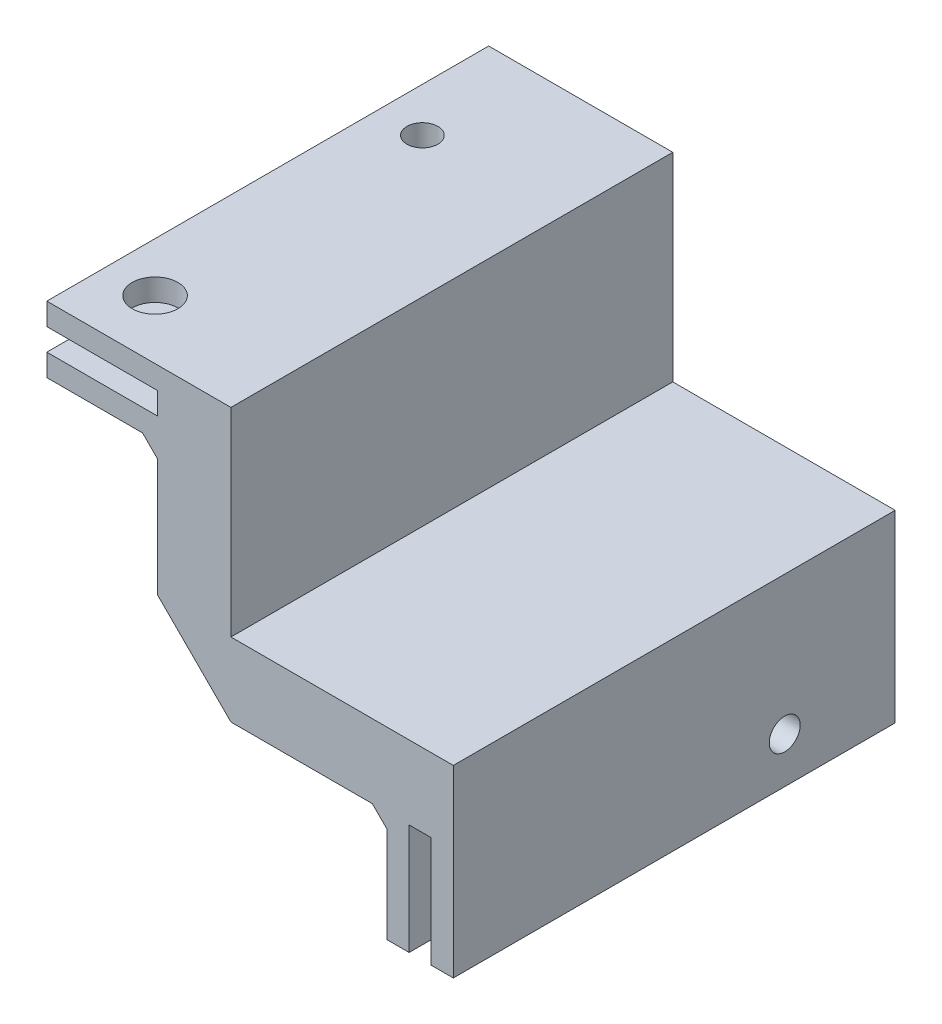
ISO-10303-21;
HEADER;
FILE_DESCRIPTION(('STEP AP214'),'2;1');
FILE_NAME('part.step','',(''),(''),'','','');
FILE_SCHEMA(('AUTOMOTIVE_DESIGN { 1 0 10303 214 1 1 1 1 }'));
ENDSEC;
DATA;
#1=APPLICATION_CONTEXT('core data for automotive mechanical design processes');
#2=APPLICATION_PROTOCOL_DEFINITION('international standard','automotive_design',2000,#1);
#3=PRODUCT_CONTEXT('',#1,'mechanical');
#4=PRODUCT('Part','Part','',(#3));
#5=PRODUCT_RELATED_PRODUCT_CATEGORY('part','',(#4));
#6=PRODUCT_DEFINITION_FORMATION('','',#4);
#7=PRODUCT_DEFINITION_CONTEXT('part definition',#1,'design');
#8=PRODUCT_DEFINITION('design','',#6,#7);
#9=PRODUCT_DEFINITION_SHAPE('','',#8);
#10=(LENGTH_UNIT() NAMED_UNIT(*) SI_UNIT(.MILLI.,.METRE.));
#11=(NAMED_UNIT(*) PLANE_ANGLE_UNIT() SI_UNIT($,.RADIAN.));
#12=(NAMED_UNIT(*) SI_UNIT($,.STERADIAN.) SOLID_ANGLE_UNIT());
#13=UNCERTAINTY_MEASURE_WITH_UNIT(LENGTH_MEASURE(1.E-05),#10,'distance_accuracy_value','');
#14=(GEOMETRIC_REPRESENTATION_CONTEXT(3) GLOBAL_UNCERTAINTY_ASSIGNED_CONTEXT((#13)) GLOBAL_UNIT_ASSIGNED_CONTEXT((#10,
#11,#12)) REPRESENTATION_CONTEXT('',''));
#15=CARTESIAN_POINT('',(0.,0.,0.));
#16=DIRECTION('',(0.,0.,1.));
#17=DIRECTION('',(1.,0.,0.));
#18=AXIS2_PLACEMENT_3D('',#15,#16,#17);
#19=CARTESIAN_POINT('',(0.,0.,60.));
#20=DIRECTION('',(-1.,0.,0.));
#21=DIRECTION('',(0.,0.,1.));
#22=AXIS2_PLACEMENT_3D('',#19,#20,#21);
#23=PLANE('',#22);
#24=CARTESIAN_POINT('',(0.,6.2,15.));
#25=DIRECTION('',(-1.,0.,0.));
#26=DIRECTION('',(0.,0.,1.));
#27=AXIS2_PLACEMENT_3D('',#24,#25,#26);
#28=CIRCLE('',#27,2.1);
#29=CARTESIAN_POINT('',(0.,6.2,17.1));
#30=VERTEX_POINT('',#29);
#31=EDGE_CURVE('E555',#30,#30,#28,.T.);
#32=ORIENTED_EDGE('',*,*,#31,.T.);
#33=EDGE_LOOP('',(#32));
#34=FACE_BOUND('',#33,.T.);
#35=DIRECTION('',(0.,1.,0.));
#36=VECTOR('',#35,1.);
#37=CARTESIAN_POINT('',(0.,0.,0.));
#38=LINE('',#37,#36);
#39=CARTESIAN_POINT('',(0.,0.,0.));
#40=VERTEX_POINT('',#39);
#41=CARTESIAN_POINT('',(0.,25.,0.));
#42=VERTEX_POINT('',#41);
#43=EDGE_CURVE('E217',#40,#42,#38,.T.);
#44=ORIENTED_EDGE('',*,*,#43,.T.);
#45=DIRECTION('',(0.,0.,-1.));
#46=VECTOR('',#45,1.);
#47=CARTESIAN_POINT('',(0.,25.,60.));
#48=LINE('',#47,#46);
#49=CARTESIAN_POINT('',(0.,25.,60.));
#50=VERTEX_POINT('',#49);
#51=EDGE_CURVE('E196',#50,#42,#48,.T.);
#52=ORIENTED_EDGE('',*,*,#51,.F.);
#53=DIRECTION('',(0.,1.,0.));
#54=VECTOR('',#53,1.);
#55=CARTESIAN_POINT('',(0.,0.,60.));
#56=LINE('',#55,#54);
#57=CARTESIAN_POINT('',(0.,0.,60.));
#58=VERTEX_POINT('',#57);
#59=EDGE_CURVE('E204',#58,#50,#56,.T.);
#60=ORIENTED_EDGE('',*,*,#59,.F.);
#61=DIRECTION('',(0.,0.,-1.));
#62=VECTOR('',#61,1.);
#63=CARTESIAN_POINT('',(0.,0.,60.));
#64=LINE('',#63,#62);
#65=EDGE_CURVE('E301',#58,#40,#64,.T.);
#66=ORIENTED_EDGE('',*,*,#65,.T.);
#67=EDGE_LOOP('',(#44,#52,#60,#66));
#68=FACE_BOUND('',#67,.T.);
#69=ADVANCED_FACE('F46',(#34,#68),#23,.F.);
#70=CARTESIAN_POINT('',(0.,25.,60.));
#71=DIRECTION('',(0.,-1.,0.));
#72=DIRECTION('',(1.,0.,0.));
#73=AXIS2_PLACEMENT_3D('',#70,#71,#72);
#74=PLANE('',#73);
#75=DIRECTION('',(-1.,0.,0.));
#76=VECTOR('',#75,1.);
#77=CARTESIAN_POINT('',(0.,25.,0.));
#78=LINE('',#77,#76);
#79=CARTESIAN_POINT('',(-30.2,25.,0.));
#80=VERTEX_POINT('',#79);
#81=EDGE_CURVE('E373',#42,#80,#78,.T.);
#82=ORIENTED_EDGE('',*,*,#81,.T.);
#83=DIRECTION('',(0.,0.,-1.));
#84=VECTOR('',#83,1.);
#85=CARTESIAN_POINT('',(-30.2,25.,60.));
#86=LINE('',#85,#84);
#87=CARTESIAN_POINT('',(-30.2,25.,60.));
#88=VERTEX_POINT('',#87);
#89=EDGE_CURVE('E199',#88,#80,#86,.T.);
#90=ORIENTED_EDGE('',*,*,#89,.F.);
#91=DIRECTION('',(-1.,0.,0.));
#92=VECTOR('',#91,1.);
#93=CARTESIAN_POINT('',(0.,25.,60.));
#94=LINE('',#93,#92);
#95=EDGE_CURVE('E192',#50,#88,#94,.T.);
#96=ORIENTED_EDGE('',*,*,#95,.F.);
#97=ORIENTED_EDGE('',*,*,#51,.T.);
#98=EDGE_LOOP('',(#82,#90,#96,#97));
#99=FACE_BOUND('',#98,.T.);
#100=ADVANCED_FACE('F194',(#99),#74,.F.);
#101=CARTESIAN_POINT('',(-30.2,25.,60.));
#102=DIRECTION('',(-1.,0.,0.));
#103=DIRECTION('',(0.,0.,1.));
#104=AXIS2_PLACEMENT_3D('',#101,#102,#103);
#105=PLANE('',#104);
#106=DIRECTION('',(0.,1.,0.));
#107=VECTOR('',#106,1.);
#108=CARTESIAN_POINT('',(-30.2,25.,0.));
#109=LINE('',#108,#107);
#110=CARTESIAN_POINT('',(-30.2,52.,0.));
#111=VERTEX_POINT('',#110);
#112=EDGE_CURVE('E364',#80,#111,#109,.T.);
#113=ORIENTED_EDGE('',*,*,#112,.T.);
#114=DIRECTION('',(0.,0.,-1.));
#115=VECTOR('',#114,1.);
#116=CARTESIAN_POINT('',(-30.2,52.,60.));
#117=LINE('',#116,#115);
#118=CARTESIAN_POINT('',(-30.2,52.,60.));
#119=VERTEX_POINT('',#118);
#120=EDGE_CURVE('E226',#119,#111,#117,.T.);
#121=ORIENTED_EDGE('',*,*,#120,.F.);
#122=DIRECTION('',(0.,1.,0.));
#123=VECTOR('',#122,1.);
#124=CARTESIAN_POINT('',(-30.2,25.,60.));
#125=LINE('',#124,#123);
#126=EDGE_CURVE('E203',#88,#119,#125,.T.);
#127=ORIENTED_EDGE('',*,*,#126,.F.);
#128=ORIENTED_EDGE('',*,*,#89,.T.);
#129=EDGE_LOOP('',(#113,#121,#127,#128));
#130=FACE_BOUND('',#129,.T.);
#131=ADVANCED_FACE('F426',(#130),#105,.F.);
#132=CARTESIAN_POINT('',(-30.2,52.,60.));
#133=DIRECTION('',(0.,-1.,0.));
#134=DIRECTION('',(1.,0.,0.));
#135=AXIS2_PLACEMENT_3D('',#132,#133,#134);
#136=PLANE('',#135);
#137=CARTESIAN_POINT('',(-49.2,52.,15.));
#138=DIRECTION('',(0.,-1.,0.));
#139=DIRECTION('',(1.,0.,0.));
#140=AXIS2_PLACEMENT_3D('',#137,#138,#139);
#141=CIRCLE('',#140,2.1);
#142=CARTESIAN_POINT('',(-47.1,52.,15.));
#143=VERTEX_POINT('',#142);
#144=EDGE_CURVE('E576',#143,#143,#141,.T.);
#145=ORIENTED_EDGE('',*,*,#144,.T.);
#146=EDGE_LOOP('',(#145));
#147=FACE_BOUND('',#146,.T.);
#148=CARTESIAN_POINT('',(-48.5,52.,52.));
#149=DIRECTION('',(0.,-1.,0.));
#150=DIRECTION('',(1.,0.,0.));
#151=AXIS2_PLACEMENT_3D('',#148,#149,#150);
#152=CIRCLE('',#151,3.1);
#153=CARTESIAN_POINT('',(-45.4,52.,52.));
#154=VERTEX_POINT('',#153);
#155=EDGE_CURVE('E424',#154,#154,#152,.T.);
#156=ORIENTED_EDGE('',*,*,#155,.T.);
#157=EDGE_LOOP('',(#156));
#158=FACE_BOUND('',#157,.T.);
#159=DIRECTION('',(-1.,0.,0.));
#160=VECTOR('',#159,1.);
#161=CARTESIAN_POINT('',(-30.2,52.,0.));
#162=LINE('',#161,#160);
#163=CARTESIAN_POINT('',(-55.2,52.,0.));
#164=VERTEX_POINT('',#163);
#165=EDGE_CURVE('E359',#111,#164,#162,.T.);
#166=ORIENTED_EDGE('',*,*,#165,.T.);
#167=DIRECTION('',(0.,0.,-1.));
#168=VECTOR('',#167,1.);
#169=CARTESIAN_POINT('',(-55.2,52.,60.));
#170=LINE('',#169,#168);
#171=CARTESIAN_POINT('',(-55.2,52.,60.));
#172=VERTEX_POINT('',#171);
#173=EDGE_CURVE('E348',#172,#164,#170,.T.);
#174=ORIENTED_EDGE('',*,*,#173,.F.);
#175=DIRECTION('',(-1.,0.,0.));
#176=VECTOR('',#175,1.);
#177=CARTESIAN_POINT('',(-30.2,52.,60.));
#178=LINE('',#177,#176);
#179=EDGE_CURVE('E360',#119,#172,#178,.T.);
#180=ORIENTED_EDGE('',*,*,#179,.F.);
#181=ORIENTED_EDGE('',*,*,#120,.T.);
#182=EDGE_LOOP('',(#166,#174,#180,#181));
#183=FACE_BOUND('',#182,.T.);
#184=ADVANCED_FACE('F357',(#147,#158,#183),#136,.F.);
#185=CARTESIAN_POINT('',(-55.2,52.,60.));
#186=DIRECTION('',(1.,0.,0.));
#187=DIRECTION('',(0.,1.,0.));
#188=AXIS2_PLACEMENT_3D('',#185,#186,#187);
#189=PLANE('',#188);
#190=DIRECTION('',(0.,-1.,0.));
#191=VECTOR('',#190,1.);
#192=CARTESIAN_POINT('',(-55.2,52.,0.));
#193=LINE('',#192,#191);
#194=CARTESIAN_POINT('',(-55.2,49.,0.));
#195=VERTEX_POINT('',#194);
#196=EDGE_CURVE('E366',#164,#195,#193,.T.);
#197=ORIENTED_EDGE('',*,*,#196,.T.);
#198=DIRECTION('',(0.,0.,-1.));
#199=VECTOR('',#198,1.);
#200=CARTESIAN_POINT('',(-55.2,49.,60.));
#201=LINE('',#200,#199);
#202=CARTESIAN_POINT('',(-55.2,49.,60.));
#203=VERTEX_POINT('',#202);
#204=EDGE_CURVE('E344',#203,#195,#201,.T.);
#205=ORIENTED_EDGE('',*,*,#204,.F.);
#206=DIRECTION('',(0.,-1.,0.));
#207=VECTOR('',#206,1.);
#208=CARTESIAN_POINT('',(-55.2,52.,60.));
#209=LINE('',#208,#207);
#210=EDGE_CURVE('E430',#172,#203,#209,.T.);
#211=ORIENTED_EDGE('',*,*,#210,.F.);
#212=ORIENTED_EDGE('',*,*,#173,.T.);
#213=EDGE_LOOP('',(#197,#205,#211,#212));
#214=FACE_BOUND('',#213,.T.);
#215=ADVANCED_FACE('F480',(#214),#189,.F.);
#216=CARTESIAN_POINT('',(-55.2,49.,60.));
#217=DIRECTION('',(0.,1.,0.));
#218=DIRECTION('',(0.,0.,1.));
#219=AXIS2_PLACEMENT_3D('',#216,#217,#218);
#220=PLANE('',#219);
#221=CARTESIAN_POINT('',(-49.2,49.,15.));
#222=DIRECTION('',(0.,1.,0.));
#223=DIRECTION('',(0.,0.,1.));
#224=AXIS2_PLACEMENT_3D('',#221,#222,#223);
#225=CIRCLE('',#224,2.1);
#226=CARTESIAN_POINT('',(-49.2,49.,17.1));
#227=VERTEX_POINT('',#226);
#228=EDGE_CURVE('E572',#227,#227,#225,.T.);
#229=ORIENTED_EDGE('',*,*,#228,.T.);
#230=EDGE_LOOP('',(#229));
#231=FACE_BOUND('',#230,.T.);
#232=CARTESIAN_POINT('',(-48.5,49.,52.));
#233=DIRECTION('',(0.,1.,0.));
#234=DIRECTION('',(0.,0.,1.));
#235=AXIS2_PLACEMENT_3D('',#232,#233,#234);
#236=CIRCLE('',#235,3.1);
#237=CARTESIAN_POINT('',(-48.5,49.,55.1));
#238=VERTEX_POINT('',#237);
#239=EDGE_CURVE('E588',#238,#238,#236,.T.);
#240=ORIENTED_EDGE('',*,*,#239,.T.);
#241=EDGE_LOOP('',(#240));
#242=FACE_BOUND('',#241,.T.);
#243=DIRECTION('',(1.,0.,0.));
#244=VECTOR('',#243,1.);
#245=CARTESIAN_POINT('',(-55.2,49.,0.));
#246=LINE('',#245,#244);
#247=CARTESIAN_POINT('',(-40.2,49.,0.));
#248=VERTEX_POINT('',#247);
#249=EDGE_CURVE('E371',#195,#248,#246,.T.);
#250=ORIENTED_EDGE('',*,*,#249,.T.);
#251=DIRECTION('',(0.,0.,-1.));
#252=VECTOR('',#251,1.);
#253=CARTESIAN_POINT('',(-40.2,49.,60.));
#254=LINE('',#253,#252);
#255=CARTESIAN_POINT('',(-40.2,49.,60.));
#256=VERTEX_POINT('',#255);
#257=EDGE_CURVE('E340',#256,#248,#254,.T.);
#258=ORIENTED_EDGE('',*,*,#257,.F.);
#259=DIRECTION('',(1.,0.,0.));
#260=VECTOR('',#259,1.);
#261=CARTESIAN_POINT('',(-55.2,49.,60.));
#262=LINE('',#261,#260);
#263=EDGE_CURVE('E435',#203,#256,#262,.T.);
#264=ORIENTED_EDGE('',*,*,#263,.F.);
#265=ORIENTED_EDGE('',*,*,#204,.T.);
#266=EDGE_LOOP('',(#250,#258,#264,#265));
#267=FACE_BOUND('',#266,.T.);
#268=ADVANCED_FACE('F484',(#231,#242,#267),#220,.F.);
#269=CARTESIAN_POINT('',(-40.2,49.,60.));
#270=DIRECTION('',(1.,0.,0.));
#271=DIRECTION('',(0.,1.,0.));
#272=AXIS2_PLACEMENT_3D('',#269,#270,#271);
#273=PLANE('',#272);
#274=DIRECTION('',(0.,-1.,0.));
#275=VECTOR('',#274,1.);
#276=CARTESIAN_POINT('',(-40.2,49.,0.));
#277=LINE('',#276,#275);
#278=CARTESIAN_POINT('',(-40.2,46.,0.));
#279=VERTEX_POINT('',#278);
#280=EDGE_CURVE('E379',#248,#279,#277,.T.);
#281=ORIENTED_EDGE('',*,*,#280,.T.);
#282=DIRECTION('',(0.,0.,-1.));
#283=VECTOR('',#282,1.);
#284=CARTESIAN_POINT('',(-40.2,46.,60.));
#285=LINE('',#284,#283);
#286=CARTESIAN_POINT('',(-40.2,46.,60.));
#287=VERTEX_POINT('',#286);
#288=EDGE_CURVE('E336',#287,#279,#285,.T.);
#289=ORIENTED_EDGE('',*,*,#288,.F.);
#290=DIRECTION('',(0.,-1.,0.));
#291=VECTOR('',#290,1.);
#292=CARTESIAN_POINT('',(-40.2,49.,60.));
#293=LINE('',#292,#291);
#294=EDGE_CURVE('E438',#256,#287,#293,.T.);
#295=ORIENTED_EDGE('',*,*,#294,.F.);
#296=ORIENTED_EDGE('',*,*,#257,.T.);
#297=EDGE_LOOP('',(#281,#289,#295,#296));
#298=FACE_BOUND('',#297,.T.);
#299=ADVANCED_FACE('F488',(#298),#273,.F.);
#300=CARTESIAN_POINT('',(-40.2,46.,60.));
#301=DIRECTION('',(0.,-1.,0.));
#302=DIRECTION('',(0.,0.,-1.));
#303=AXIS2_PLACEMENT_3D('',#300,#301,#302);
#304=PLANE('',#303);
#305=CARTESIAN_POINT('',(-49.2,46.,15.));
#306=DIRECTION('',(0.,-1.,0.));
#307=DIRECTION('',(0.,0.,-1.));
#308=AXIS2_PLACEMENT_3D('',#305,#306,#307);
#309=CIRCLE('',#308,2.1);
#310=CARTESIAN_POINT('',(-49.2,46.,12.9));
#311=VERTEX_POINT('',#310);
#312=EDGE_CURVE('E563',#311,#311,#309,.T.);
#313=ORIENTED_EDGE('',*,*,#312,.T.);
#314=EDGE_LOOP('',(#313));
#315=FACE_BOUND('',#314,.T.);
#316=CARTESIAN_POINT('',(-48.5,46.,52.));
#317=DIRECTION('',(0.,-1.,0.));
#318=DIRECTION('',(0.,0.,-1.));
#319=AXIS2_PLACEMENT_3D('',#316,#317,#318);
#320=CIRCLE('',#319,3.1);
#321=CARTESIAN_POINT('',(-48.5,46.,48.9));
#322=VERTEX_POINT('',#321);
#323=EDGE_CURVE('E584',#322,#322,#320,.T.);
#324=ORIENTED_EDGE('',*,*,#323,.T.);
#325=EDGE_LOOP('',(#324));
#326=FACE_BOUND('',#325,.T.);
#327=DIRECTION('',(-1.,0.,0.));
#328=VECTOR('',#327,1.);
#329=CARTESIAN_POINT('',(-40.2,46.,0.));
#330=LINE('',#329,#328);
#331=CARTESIAN_POINT('',(-55.2,46.,0.));
#332=VERTEX_POINT('',#331);
#333=EDGE_CURVE('E382',#279,#332,#330,.T.);
#334=ORIENTED_EDGE('',*,*,#333,.T.);
#335=DIRECTION('',(0.,0.,-1.));
#336=VECTOR('',#335,1.);
#337=CARTESIAN_POINT('',(-55.2,46.,60.));
#338=LINE('',#337,#336);
#339=CARTESIAN_POINT('',(-55.2,46.,60.));
#340=VERTEX_POINT('',#339);
#341=EDGE_CURVE('E332',#340,#332,#338,.T.);
#342=ORIENTED_EDGE('',*,*,#341,.F.);
#343=DIRECTION('',(-1.,0.,0.));
#344=VECTOR('',#343,1.);
#345=CARTESIAN_POINT('',(-40.2,46.,60.));
#346=LINE('',#345,#344);
#347=EDGE_CURVE('E441',#287,#340,#346,.T.);
#348=ORIENTED_EDGE('',*,*,#347,.F.);
#349=ORIENTED_EDGE('',*,*,#288,.T.);
#350=EDGE_LOOP('',(#334,#342,#348,#349));
#351=FACE_BOUND('',#350,.T.);
#352=ADVANCED_FACE('F492',(#315,#326,#351),#304,.F.);
#353=CARTESIAN_POINT('',(-55.2,46.,60.));
#354=DIRECTION('',(1.,0.,0.));
#355=DIRECTION('',(0.,1.,0.));
#356=AXIS2_PLACEMENT_3D('',#353,#354,#355);
#357=PLANE('',#356);
#358=DIRECTION('',(0.,-1.,0.));
#359=VECTOR('',#358,1.);
#360=CARTESIAN_POINT('',(-55.2,46.,0.));
#361=LINE('',#360,#359);
#362=CARTESIAN_POINT('',(-55.2,43.,0.));
#363=VERTEX_POINT('',#362);
#364=EDGE_CURVE('E385',#332,#363,#361,.T.);
#365=ORIENTED_EDGE('',*,*,#364,.T.);
#366=DIRECTION('',(0.,0.,-1.));
#367=VECTOR('',#366,1.);
#368=CARTESIAN_POINT('',(-55.2,43.,60.));
#369=LINE('',#368,#367);
#370=CARTESIAN_POINT('',(-55.2,43.,60.));
#371=VERTEX_POINT('',#370);
#372=EDGE_CURVE('E328',#371,#363,#369,.T.);
#373=ORIENTED_EDGE('',*,*,#372,.F.);
#374=DIRECTION('',(0.,-1.,0.));
#375=VECTOR('',#374,1.);
#376=CARTESIAN_POINT('',(-55.2,46.,60.));
#377=LINE('',#376,#375);
#378=EDGE_CURVE('E444',#340,#371,#377,.T.);
#379=ORIENTED_EDGE('',*,*,#378,.F.);
#380=ORIENTED_EDGE('',*,*,#341,.T.);
#381=EDGE_LOOP('',(#365,#373,#379,#380));
#382=FACE_BOUND('',#381,.T.);
#383=ADVANCED_FACE('F496',(#382),#357,.F.);
#384=CARTESIAN_POINT('',(-55.2,43.,60.));
#385=DIRECTION('',(0.,1.,0.));
#386=DIRECTION('',(0.,0.,1.));
#387=AXIS2_PLACEMENT_3D('',#384,#385,#386);
#388=PLANE('',#387);
#389=CARTESIAN_POINT('',(-49.2,43.,15.));
#390=DIRECTION('',(0.,-1.,0.));
#391=DIRECTION('',(0.,0.,-1.));
#392=AXIS2_PLACEMENT_3D('',#389,#390,#391);
#393=CIRCLE('',#392,2.1);
#394=CARTESIAN_POINT('',(-49.2,43.,12.9));
#395=VERTEX_POINT('',#394);
#396=EDGE_CURVE('E557',#395,#395,#393,.T.);
#397=ORIENTED_EDGE('',*,*,#396,.F.);
#398=EDGE_LOOP('',(#397));
#399=FACE_BOUND('',#398,.T.);
#400=CARTESIAN_POINT('',(-48.5,43.,52.));
#401=DIRECTION('',(0.,-1.,0.));
#402=DIRECTION('',(0.,0.,-1.));
#403=AXIS2_PLACEMENT_3D('',#400,#401,#402);
#404=CIRCLE('',#403,3.1);
#405=CARTESIAN_POINT('',(-48.5,43.,48.9));
#406=VERTEX_POINT('',#405);
#407=EDGE_CURVE('E580',#406,#406,#404,.T.);
#408=ORIENTED_EDGE('',*,*,#407,.F.);
#409=EDGE_LOOP('',(#408));
#410=FACE_BOUND('',#409,.T.);
#411=DIRECTION('',(1.,0.,0.));
#412=VECTOR('',#411,1.);
#413=CARTESIAN_POINT('',(-55.2,43.,0.));
#414=LINE('',#413,#412);
#415=CARTESIAN_POINT('',(-42.2,43.,0.));
#416=VERTEX_POINT('',#415);
#417=EDGE_CURVE('E388',#363,#416,#414,.T.);
#418=ORIENTED_EDGE('',*,*,#417,.T.);
#419=DIRECTION('',(0.,0.,1.));
#420=VECTOR('',#419,1.);
#421=CARTESIAN_POINT('',(-42.2,43.,60.));
#422=LINE('',#421,#420);
#423=CARTESIAN_POINT('',(-42.2,43.,60.));
#424=VERTEX_POINT('',#423);
#425=EDGE_CURVE('E64',#416,#424,#422,.T.);
#426=ORIENTED_EDGE('',*,*,#425,.T.);
#427=DIRECTION('',(1.,0.,0.));
#428=VECTOR('',#427,1.);
#429=CARTESIAN_POINT('',(-55.2,43.,60.));
#430=LINE('',#429,#428);
#431=EDGE_CURVE('E406',#371,#424,#430,.T.);
#432=ORIENTED_EDGE('',*,*,#431,.F.);
#433=ORIENTED_EDGE('',*,*,#372,.T.);
#434=EDGE_LOOP('',(#418,#426,#432,#433));
#435=FACE_BOUND('',#434,.T.);
#436=ADVANCED_FACE('F500',(#399,#410,#435),#388,.F.);
#437=CARTESIAN_POINT('',(-40.2,43.,60.));
#438=DIRECTION('',(1.,0.,0.));
#439=DIRECTION('',(0.,1.,0.));
#440=AXIS2_PLACEMENT_3D('',#437,#438,#439);
#441=PLANE('',#440);
#442=DIRECTION('',(0.,-1.,0.));
#443=VECTOR('',#442,1.);
#444=CARTESIAN_POINT('',(-40.2,43.,60.));
#445=LINE('',#444,#443);
#446=CARTESIAN_POINT('',(-40.2,41.,60.));
#447=VERTEX_POINT('',#446);
#448=CARTESIAN_POINT('',(-40.2,25.,60.));
#449=VERTEX_POINT('',#448);
#450=EDGE_CURVE('E401',#447,#449,#445,.T.);
#451=ORIENTED_EDGE('',*,*,#450,.F.);
#452=DIRECTION('',(0.,0.,-1.));
#453=VECTOR('',#452,1.);
#454=CARTESIAN_POINT('',(-40.2,41.,0.));
#455=LINE('',#454,#453);
#456=CARTESIAN_POINT('',(-40.2,41.,0.));
#457=VERTEX_POINT('',#456);
#458=EDGE_CURVE('E232',#447,#457,#455,.T.);
#459=ORIENTED_EDGE('',*,*,#458,.T.);
#460=DIRECTION('',(0.,-1.,0.));
#461=VECTOR('',#460,1.);
#462=CARTESIAN_POINT('',(-40.2,43.,0.));
#463=LINE('',#462,#461);
#464=CARTESIAN_POINT('',(-40.2,25.,0.));
#465=VERTEX_POINT('',#464);
#466=EDGE_CURVE('E284',#457,#465,#463,.T.);
#467=ORIENTED_EDGE('',*,*,#466,.T.);
#468=DIRECTION('',(0.,0.,-1.));
#469=VECTOR('',#468,1.);
#470=CARTESIAN_POINT('',(-40.2,25.,60.));
#471=LINE('',#470,#469);
#472=EDGE_CURVE('E324',#449,#465,#471,.T.);
#473=ORIENTED_EDGE('',*,*,#472,.F.);
#474=EDGE_LOOP('',(#451,#459,#467,#473));
#475=FACE_BOUND('',#474,.T.);
#476=ADVANCED_FACE('F394',(#475),#441,.F.);
#477=CARTESIAN_POINT('',(-40.2,25.,60.));
#478=DIRECTION('',(0.707106781186548,0.707106781186547,0.));
#479=DIRECTION('',(-0.707106781186547,0.707106781186548,0.));
#480=AXIS2_PLACEMENT_3D('',#477,#478,#479);
#481=PLANE('',#480);
#482=DIRECTION('',(0.707106781186547,-0.707106781186548,0.));
#483=VECTOR('',#482,1.);
#484=CARTESIAN_POINT('',(-40.2,25.,0.));
#485=LINE('',#484,#483);
#486=CARTESIAN_POINT('',(-30.2,15.,0.));
#487=VERTEX_POINT('',#486);
#488=EDGE_CURVE('E278',#465,#487,#485,.T.);
#489=ORIENTED_EDGE('',*,*,#488,.T.);
#490=DIRECTION('',(0.,0.,-1.));
#491=VECTOR('',#490,1.);
#492=CARTESIAN_POINT('',(-30.2,15.,60.));
#493=LINE('',#492,#491);
#494=CARTESIAN_POINT('',(-30.2,15.,60.));
#495=VERTEX_POINT('',#494);
#496=EDGE_CURVE('E276',#495,#487,#493,.T.);
#497=ORIENTED_EDGE('',*,*,#496,.F.);
#498=DIRECTION('',(0.707106781186547,-0.707106781186548,0.));
#499=VECTOR('',#498,1.);
#500=CARTESIAN_POINT('',(-40.2,25.,60.));
#501=LINE('',#500,#499);
#502=EDGE_CURVE('E399',#449,#495,#501,.T.);
#503=ORIENTED_EDGE('',*,*,#502,.F.);
#504=ORIENTED_EDGE('',*,*,#472,.T.);
#505=EDGE_LOOP('',(#489,#497,#503,#504));
#506=FACE_BOUND('',#505,.T.);
#507=ADVANCED_FACE('F398',(#506),#481,.F.);
#508=CARTESIAN_POINT('',(-9.,15.,60.));
#509=DIRECTION('',(0.,1.,0.));
#510=DIRECTION('',(-1.,0.,0.));
#511=AXIS2_PLACEMENT_3D('',#508,#509,#510);
#512=PLANE('',#511);
#513=DIRECTION('',(1.,0.,0.));
#514=VECTOR('',#513,1.);
#515=CARTESIAN_POINT('',(-9.,15.,0.));
#516=LINE('',#515,#514);
#517=CARTESIAN_POINT('',(-11.,15.,0.));
#518=VERTEX_POINT('',#517);
#519=EDGE_CURVE('E269',#487,#518,#516,.T.);
#520=ORIENTED_EDGE('',*,*,#519,.T.);
#521=DIRECTION('',(0.,0.,1.));
#522=VECTOR('',#521,1.);
#523=CARTESIAN_POINT('',(-11.,15.,60.));
#524=LINE('',#523,#522);
#525=CARTESIAN_POINT('',(-11.,15.,60.));
#526=VERTEX_POINT('',#525);
#527=EDGE_CURVE('E224',#518,#526,#524,.T.);
#528=ORIENTED_EDGE('',*,*,#527,.T.);
#529=DIRECTION('',(1.,0.,0.));
#530=VECTOR('',#529,1.);
#531=CARTESIAN_POINT('',(-9.,15.,60.));
#532=LINE('',#531,#530);
#533=EDGE_CURVE('E251',#495,#526,#532,.T.);
#534=ORIENTED_EDGE('',*,*,#533,.F.);
#535=ORIENTED_EDGE('',*,*,#496,.T.);
#536=EDGE_LOOP('',(#520,#528,#534,#535));
#537=FACE_BOUND('',#536,.T.);
#538=ADVANCED_FACE('F274',(#537),#512,.F.);
#539=CARTESIAN_POINT('',(-9.,0.,60.));
#540=DIRECTION('',(1.,0.,0.));
#541=DIRECTION('',(0.,0.,-1.));
#542=AXIS2_PLACEMENT_3D('',#539,#540,#541);
#543=PLANE('',#542);
#544=CARTESIAN_POINT('',(-9.,6.2,15.));
#545=DIRECTION('',(-1.,0.,0.));
#546=DIRECTION('',(0.,0.,1.));
#547=AXIS2_PLACEMENT_3D('',#544,#545,#546);
#548=CIRCLE('',#547,2.1);
#549=CARTESIAN_POINT('',(-9.,6.2,17.1));
#550=VERTEX_POINT('',#549);
#551=EDGE_CURVE('E793',#550,#550,#548,.T.);
#552=ORIENTED_EDGE('',*,*,#551,.F.);
#553=EDGE_LOOP('',(#552));
#554=FACE_BOUND('',#553,.T.);
#555=DIRECTION('',(0.,-1.,0.));
#556=VECTOR('',#555,1.);
#557=CARTESIAN_POINT('',(-9.,0.,60.));
#558=LINE('',#557,#556);
#559=CARTESIAN_POINT('',(-9.,13.,60.));
#560=VERTEX_POINT('',#559);
#561=CARTESIAN_POINT('',(-9.,0.,60.));
#562=VERTEX_POINT('',#561);
#563=EDGE_CURVE('E248',#560,#562,#558,.T.);
#564=ORIENTED_EDGE('',*,*,#563,.F.);
#565=DIRECTION('',(0.,0.,-1.));
#566=VECTOR('',#565,1.);
#567=CARTESIAN_POINT('',(-9.,13.,0.));
#568=LINE('',#567,#566);
#569=CARTESIAN_POINT('',(-9.,13.,0.));
#570=VERTEX_POINT('',#569);
#571=EDGE_CURVE('E219',#560,#570,#568,.T.);
#572=ORIENTED_EDGE('',*,*,#571,.T.);
#573=DIRECTION('',(0.,-1.,0.));
#574=VECTOR('',#573,1.);
#575=CARTESIAN_POINT('',(-9.,0.,0.));
#576=LINE('',#575,#574);
#577=CARTESIAN_POINT('',(-9.,0.,0.));
#578=VERTEX_POINT('',#577);
#579=EDGE_CURVE('E271',#570,#578,#576,.T.);
#580=ORIENTED_EDGE('',*,*,#579,.T.);
#581=DIRECTION('',(0.,0.,-1.));
#582=VECTOR('',#581,1.);
#583=CARTESIAN_POINT('',(-9.,0.,60.));
#584=LINE('',#583,#582);
#585=EDGE_CURVE('E259',#562,#578,#584,.T.);
#586=ORIENTED_EDGE('',*,*,#585,.F.);
#587=EDGE_LOOP('',(#564,#572,#580,#586));
#588=FACE_BOUND('',#587,.T.);
#589=ADVANCED_FACE('F256',(#554,#588),#543,.F.);
#590=CARTESIAN_POINT('',(-6.,0.,60.));
#591=DIRECTION('',(0.,1.,0.));
#592=DIRECTION('',(-1.,0.,0.));
#593=AXIS2_PLACEMENT_3D('',#590,#591,#592);
#594=PLANE('',#593);
#595=DIRECTION('',(1.,0.,0.));
#596=VECTOR('',#595,1.);
#597=CARTESIAN_POINT('',(-6.,0.,0.));
#598=LINE('',#597,#596);
#599=CARTESIAN_POINT('',(-6.,0.,0.));
#600=VERTEX_POINT('',#599);
#601=EDGE_CURVE('E282',#578,#600,#598,.T.);
#602=ORIENTED_EDGE('',*,*,#601,.T.);
#603=DIRECTION('',(0.,0.,-1.));
#604=VECTOR('',#603,1.);
#605=CARTESIAN_POINT('',(-6.,0.,60.));
#606=LINE('',#605,#604);
#607=CARTESIAN_POINT('',(-6.,0.,60.));
#608=VERTEX_POINT('',#607);
#609=EDGE_CURVE('E316',#608,#600,#606,.T.);
#610=ORIENTED_EDGE('',*,*,#609,.F.);
#611=DIRECTION('',(1.,0.,0.));
#612=VECTOR('',#611,1.);
#613=CARTESIAN_POINT('',(-6.,0.,60.));
#614=LINE('',#613,#612);
#615=EDGE_CURVE('E262',#562,#608,#614,.T.);
#616=ORIENTED_EDGE('',*,*,#615,.F.);
#617=ORIENTED_EDGE('',*,*,#585,.T.);
#618=EDGE_LOOP('',(#602,#610,#616,#617));
#619=FACE_BOUND('',#618,.T.);
#620=ADVANCED_FACE('F512',(#619),#594,.F.);
#621=CARTESIAN_POINT('',(-6.,15.,60.));
#622=DIRECTION('',(-1.,0.,0.));
#623=DIRECTION('',(0.,-1.,0.));
#624=AXIS2_PLACEMENT_3D('',#621,#622,#623);
#625=PLANE('',#624);
#626=CARTESIAN_POINT('',(-6.,6.2,15.));
#627=DIRECTION('',(-1.,0.,0.));
#628=DIRECTION('',(0.,-1.,0.));
#629=AXIS2_PLACEMENT_3D('',#626,#627,#628);
#630=CIRCLE('',#629,2.1);
#631=CARTESIAN_POINT('',(-6.,4.1,15.));
#632=VERTEX_POINT('',#631);
#633=EDGE_CURVE('E558',#632,#632,#630,.T.);
#634=ORIENTED_EDGE('',*,*,#633,.T.);
#635=EDGE_LOOP('',(#634));
#636=FACE_BOUND('',#635,.T.);
#637=DIRECTION('',(0.,1.,0.));
#638=VECTOR('',#637,1.);
#639=CARTESIAN_POINT('',(-6.,15.,0.));
#640=LINE('',#639,#638);
#641=CARTESIAN_POINT('',(-6.,15.,0.));
#642=VERTEX_POINT('',#641);
#643=EDGE_CURVE('E290',#600,#642,#640,.T.);
#644=ORIENTED_EDGE('',*,*,#643,.T.);
#645=DIRECTION('',(0.,0.,-1.));
#646=VECTOR('',#645,1.);
#647=CARTESIAN_POINT('',(-6.,15.,60.));
#648=LINE('',#647,#646);
#649=CARTESIAN_POINT('',(-6.,15.,60.));
#650=VERTEX_POINT('',#649);
#651=EDGE_CURVE('E312',#650,#642,#648,.T.);
#652=ORIENTED_EDGE('',*,*,#651,.F.);
#653=DIRECTION('',(0.,1.,0.));
#654=VECTOR('',#653,1.);
#655=CARTESIAN_POINT('',(-6.,15.,60.));
#656=LINE('',#655,#654);
#657=EDGE_CURVE('E412',#608,#650,#656,.T.);
#658=ORIENTED_EDGE('',*,*,#657,.F.);
#659=ORIENTED_EDGE('',*,*,#609,.T.);
#660=EDGE_LOOP('',(#644,#652,#658,#659));
#661=FACE_BOUND('',#660,.T.);
#662=ADVANCED_FACE('F516',(#636,#661),#625,.F.);
#663=CARTESIAN_POINT('',(-3.,15.,60.));
#664=DIRECTION('',(0.,1.,0.));
#665=DIRECTION('',(0.,0.,1.));
#666=AXIS2_PLACEMENT_3D('',#663,#664,#665);
#667=PLANE('',#666);
#668=DIRECTION('',(1.,0.,0.));
#669=VECTOR('',#668,1.);
#670=CARTESIAN_POINT('',(-3.,15.,0.));
#671=LINE('',#670,#669);
#672=CARTESIAN_POINT('',(-3.,15.,0.));
#673=VERTEX_POINT('',#672);
#674=EDGE_CURVE('E293',#642,#673,#671,.T.);
#675=ORIENTED_EDGE('',*,*,#674,.T.);
#676=DIRECTION('',(0.,0.,-1.));
#677=VECTOR('',#676,1.);
#678=CARTESIAN_POINT('',(-3.,15.,60.));
#679=LINE('',#678,#677);
#680=CARTESIAN_POINT('',(-3.,15.,60.));
#681=VERTEX_POINT('',#680);
#682=EDGE_CURVE('E308',#681,#673,#679,.T.);
#683=ORIENTED_EDGE('',*,*,#682,.F.);
#684=DIRECTION('',(1.,0.,0.));
#685=VECTOR('',#684,1.);
#686=CARTESIAN_POINT('',(-3.,15.,60.));
#687=LINE('',#686,#685);
#688=EDGE_CURVE('E415',#650,#681,#687,.T.);
#689=ORIENTED_EDGE('',*,*,#688,.F.);
#690=ORIENTED_EDGE('',*,*,#651,.T.);
#691=EDGE_LOOP('',(#675,#683,#689,#690));
#692=FACE_BOUND('',#691,.T.);
#693=ADVANCED_FACE('F520',(#692),#667,.F.);
#694=CARTESIAN_POINT('',(-3.,0.,60.));
#695=DIRECTION('',(1.,0.,0.));
#696=DIRECTION('',(0.,0.,-1.));
#697=AXIS2_PLACEMENT_3D('',#694,#695,#696);
#698=PLANE('',#697);
#699=CARTESIAN_POINT('',(-3.,6.2,15.));
#700=DIRECTION('',(1.,0.,0.));
#701=DIRECTION('',(0.,0.,-1.));
#702=AXIS2_PLACEMENT_3D('',#699,#700,#701);
#703=CIRCLE('',#702,2.1);
#704=CARTESIAN_POINT('',(-3.,6.2,12.9));
#705=VERTEX_POINT('',#704);
#706=EDGE_CURVE('E51',#705,#705,#703,.T.);
#707=ORIENTED_EDGE('',*,*,#706,.T.);
#708=EDGE_LOOP('',(#707));
#709=FACE_BOUND('',#708,.T.);
#710=DIRECTION('',(0.,-1.,0.));
#711=VECTOR('',#710,1.);
#712=CARTESIAN_POINT('',(-3.,0.,0.));
#713=LINE('',#712,#711);
#714=CARTESIAN_POINT('',(-3.,0.,0.));
#715=VERTEX_POINT('',#714);
#716=EDGE_CURVE('E296',#673,#715,#713,.T.);
#717=ORIENTED_EDGE('',*,*,#716,.T.);
#718=DIRECTION('',(0.,0.,-1.));
#719=VECTOR('',#718,1.);
#720=CARTESIAN_POINT('',(-3.,0.,60.));
#721=LINE('',#720,#719);
#722=CARTESIAN_POINT('',(-3.,0.,60.));
#723=VERTEX_POINT('',#722);
#724=EDGE_CURVE('E304',#723,#715,#721,.T.);
#725=ORIENTED_EDGE('',*,*,#724,.F.);
#726=DIRECTION('',(0.,-1.,0.));
#727=VECTOR('',#726,1.);
#728=CARTESIAN_POINT('',(-3.,0.,60.));
#729=LINE('',#728,#727);
#730=EDGE_CURVE('E418',#681,#723,#729,.T.);
#731=ORIENTED_EDGE('',*,*,#730,.F.);
#732=ORIENTED_EDGE('',*,*,#682,.T.);
#733=EDGE_LOOP('',(#717,#725,#731,#732));
#734=FACE_BOUND('',#733,.T.);
#735=ADVANCED_FACE('F524',(#709,#734),#698,.F.);
#736=CARTESIAN_POINT('',(0.,0.,60.));
#737=DIRECTION('',(0.,1.,0.));
#738=DIRECTION('',(0.,0.,1.));
#739=AXIS2_PLACEMENT_3D('',#736,#737,#738);
#740=PLANE('',#739);
#741=DIRECTION('',(1.,0.,0.));
#742=VECTOR('',#741,1.);
#743=CARTESIAN_POINT('',(0.,0.,0.));
#744=LINE('',#743,#742);
#745=EDGE_CURVE('E214',#715,#40,#744,.T.);
#746=ORIENTED_EDGE('',*,*,#745,.T.);
#747=ORIENTED_EDGE('',*,*,#65,.F.);
#748=DIRECTION('',(1.,0.,0.));
#749=VECTOR('',#748,1.);
#750=CARTESIAN_POINT('',(0.,0.,60.));
#751=LINE('',#750,#749);
#752=EDGE_CURVE('E209',#723,#58,#751,.T.);
#753=ORIENTED_EDGE('',*,*,#752,.F.);
#754=ORIENTED_EDGE('',*,*,#724,.T.);
#755=EDGE_LOOP('',(#746,#747,#753,#754));
#756=FACE_BOUND('',#755,.T.);
#757=ADVANCED_FACE('F528',(#756),#740,.F.);
#758=CARTESIAN_POINT('',(0.,0.,60.));
#759=DIRECTION('',(0.,0.,1.));
#760=DIRECTION('',(1.,0.,0.));
#761=AXIS2_PLACEMENT_3D('',#758,#759,#760);
#762=PLANE('',#761);
#763=ORIENTED_EDGE('',*,*,#59,.T.);
#764=ORIENTED_EDGE('',*,*,#95,.T.);
#765=ORIENTED_EDGE('',*,*,#126,.T.);
#766=ORIENTED_EDGE('',*,*,#179,.T.);
#767=ORIENTED_EDGE('',*,*,#210,.T.);
#768=ORIENTED_EDGE('',*,*,#263,.T.);
#769=ORIENTED_EDGE('',*,*,#294,.T.);
#770=ORIENTED_EDGE('',*,*,#347,.T.);
#771=ORIENTED_EDGE('',*,*,#378,.T.);
#772=ORIENTED_EDGE('',*,*,#431,.T.);
#773=DIRECTION('',(-0.707106781186543,0.707106781186552,0.));
#774=VECTOR('',#773,1.);
#775=CARTESIAN_POINT('',(-40.2,41.,60.));
#776=LINE('',#775,#774);
#777=EDGE_CURVE('E11',#424,#447,#776,.F.);
#778=ORIENTED_EDGE('',*,*,#777,.T.);
#779=ORIENTED_EDGE('',*,*,#450,.T.);
#780=ORIENTED_EDGE('',*,*,#502,.T.);
#781=ORIENTED_EDGE('',*,*,#533,.T.);
#782=DIRECTION('',(-0.707106781186545,0.70710678118655,0.));
#783=VECTOR('',#782,1.);
#784=CARTESIAN_POINT('',(-9.,13.,60.));
#785=LINE('',#784,#783);
#786=EDGE_CURVE('E241',#526,#560,#785,.F.);
#787=ORIENTED_EDGE('',*,*,#786,.T.);
#788=ORIENTED_EDGE('',*,*,#563,.T.);
#789=ORIENTED_EDGE('',*,*,#615,.T.);
#790=ORIENTED_EDGE('',*,*,#657,.T.);
#791=ORIENTED_EDGE('',*,*,#688,.T.);
#792=ORIENTED_EDGE('',*,*,#730,.T.);
#793=ORIENTED_EDGE('',*,*,#752,.T.);
#794=EDGE_LOOP('',(#763,#764,#765,#766,#767,#768,#769,#770,#771,#772,#778,#779,#780,#781,#787,
#788,#789,#790,#791,#792,#793));
#795=FACE_BOUND('',#794,.T.);
#796=ADVANCED_FACE('F207',(#795),#762,.T.);
#797=CARTESIAN_POINT('',(0.,0.,0.));
#798=DIRECTION('',(0.,0.,1.));
#799=DIRECTION('',(1.,0.,0.));
#800=AXIS2_PLACEMENT_3D('',#797,#798,#799);
#801=PLANE('',#800);
#802=ORIENTED_EDGE('',*,*,#43,.F.);
#803=ORIENTED_EDGE('',*,*,#745,.F.);
#804=ORIENTED_EDGE('',*,*,#716,.F.);
#805=ORIENTED_EDGE('',*,*,#674,.F.);
#806=ORIENTED_EDGE('',*,*,#643,.F.);
#807=ORIENTED_EDGE('',*,*,#601,.F.);
#808=ORIENTED_EDGE('',*,*,#579,.F.);
#809=DIRECTION('',(0.707106781186545,-0.70710678118655,0.));
#810=VECTOR('',#809,1.);
#811=CARTESIAN_POINT('',(1.99999999999996,1.99999999999995,0.));
#812=LINE('',#811,#810);
#813=EDGE_CURVE('E238',#570,#518,#812,.F.);
#814=ORIENTED_EDGE('',*,*,#813,.T.);
#815=ORIENTED_EDGE('',*,*,#519,.F.);
#816=ORIENTED_EDGE('',*,*,#488,.F.);
#817=ORIENTED_EDGE('',*,*,#466,.F.);
#818=DIRECTION('',(0.707106781186543,-0.707106781186552,0.));
#819=VECTOR('',#818,1.);
#820=CARTESIAN_POINT('',(0.399999999999721,0.399999999999716,0.));
#821=LINE('',#820,#819);
#822=EDGE_CURVE('E57',#457,#416,#821,.F.);
#823=ORIENTED_EDGE('',*,*,#822,.T.);
#824=ORIENTED_EDGE('',*,*,#417,.F.);
#825=ORIENTED_EDGE('',*,*,#364,.F.);
#826=ORIENTED_EDGE('',*,*,#333,.F.);
#827=ORIENTED_EDGE('',*,*,#280,.F.);
#828=ORIENTED_EDGE('',*,*,#249,.F.);
#829=ORIENTED_EDGE('',*,*,#196,.F.);
#830=ORIENTED_EDGE('',*,*,#165,.F.);
#831=ORIENTED_EDGE('',*,*,#112,.F.);
#832=ORIENTED_EDGE('',*,*,#81,.F.);
#833=EDGE_LOOP('',(#802,#803,#804,#805,#806,#807,#808,#814,#815,#816,#817,#823,#824,#825,#826,
#827,#828,#829,#830,#831,#832));
#834=FACE_BOUND('',#833,.T.);
#835=ADVANCED_FACE('F267',(#834),#801,.F.);
#836=CARTESIAN_POINT('',(-9.,13.,60.));
#837=DIRECTION('',(-0.70710678118655,-0.707106781186545,0.));
#838=DIRECTION('',(0.,0.,1.));
#839=AXIS2_PLACEMENT_3D('',#836,#837,#838);
#840=PLANE('',#839);
#841=ORIENTED_EDGE('',*,*,#786,.F.);
#842=ORIENTED_EDGE('',*,*,#527,.F.);
#843=ORIENTED_EDGE('',*,*,#813,.F.);
#844=ORIENTED_EDGE('',*,*,#571,.F.);
#845=EDGE_LOOP('',(#841,#842,#843,#844));
#846=FACE_BOUND('',#845,.T.);
#847=ADVANCED_FACE('F264',(#846),#840,.T.);
#848=CARTESIAN_POINT('',(-40.2,41.,60.));
#849=DIRECTION('',(-0.707106781186552,-0.707106781186543,0.));
#850=DIRECTION('',(0.,0.,1.));
#851=AXIS2_PLACEMENT_3D('',#848,#849,#850);
#852=PLANE('',#851);
#853=ORIENTED_EDGE('',*,*,#777,.F.);
#854=ORIENTED_EDGE('',*,*,#425,.F.);
#855=ORIENTED_EDGE('',*,*,#822,.F.);
#856=ORIENTED_EDGE('',*,*,#458,.F.);
#857=EDGE_LOOP('',(#853,#854,#855,#856));
#858=FACE_BOUND('',#857,.T.);
#859=ADVANCED_FACE('F49',(#858),#852,.T.);
#860=CARTESIAN_POINT('',(-48.5,53.,52.));
#861=DIRECTION('',(0.,-1.,0.));
#862=DIRECTION('',(0.,0.,-1.));
#863=AXIS2_PLACEMENT_3D('',#860,#861,#862);
#864=CYLINDRICAL_SURFACE('',#863,3.1);
#865=ORIENTED_EDGE('',*,*,#407,.T.);
#866=EDGE_LOOP('',(#865));
#867=FACE_BOUND('',#866,.T.);
#868=ORIENTED_EDGE('',*,*,#323,.F.);
#869=EDGE_LOOP('',(#868));
#870=FACE_BOUND('',#869,.T.);
#871=ADVANCED_FACE('F452',(#867,#870),#864,.F.);
#872=ORIENTED_EDGE('',*,*,#239,.F.);
#873=EDGE_LOOP('',(#872));
#874=FACE_BOUND('',#873,.T.);
#875=ORIENTED_EDGE('',*,*,#155,.F.);
#876=EDGE_LOOP('',(#875));
#877=FACE_BOUND('',#876,.T.);
#878=ADVANCED_FACE('F457',(#874,#877),#864,.F.);
#879=CARTESIAN_POINT('',(-49.2,53.,15.));
#880=DIRECTION('',(0.,-1.,0.));
#881=DIRECTION('',(0.,0.,-1.));
#882=AXIS2_PLACEMENT_3D('',#879,#880,#881);
#883=CYLINDRICAL_SURFACE('',#882,2.1);
#884=ORIENTED_EDGE('',*,*,#396,.T.);
#885=EDGE_LOOP('',(#884));
#886=FACE_BOUND('',#885,.T.);
#887=ORIENTED_EDGE('',*,*,#312,.F.);
#888=EDGE_LOOP('',(#887));
#889=FACE_BOUND('',#888,.T.);
#890=ADVANCED_FACE('F538',(#886,#889),#883,.F.);
#891=ORIENTED_EDGE('',*,*,#228,.F.);
#892=EDGE_LOOP('',(#891));
#893=FACE_BOUND('',#892,.T.);
#894=ORIENTED_EDGE('',*,*,#144,.F.);
#895=EDGE_LOOP('',(#894));
#896=FACE_BOUND('',#895,.T.);
#897=ADVANCED_FACE('F540',(#893,#896),#883,.F.);
#898=CARTESIAN_POINT('',(1.,6.2,15.));
#899=DIRECTION('',(-1.,0.,0.));
#900=DIRECTION('',(0.,0.,1.));
#901=AXIS2_PLACEMENT_3D('',#898,#899,#900);
#902=CYLINDRICAL_SURFACE('',#901,2.1);
#903=ORIENTED_EDGE('',*,*,#706,.F.);
#904=EDGE_LOOP('',(#903));
#905=FACE_BOUND('',#904,.T.);
#906=ORIENTED_EDGE('',*,*,#31,.F.);
#907=EDGE_LOOP('',(#906));
#908=FACE_BOUND('',#907,.T.);
#909=ADVANCED_FACE('F542',(#905,#908),#902,.F.);
#910=ORIENTED_EDGE('',*,*,#551,.T.);
#911=EDGE_LOOP('',(#910));
#912=FACE_BOUND('',#911,.T.);
#913=ORIENTED_EDGE('',*,*,#633,.F.);
#914=EDGE_LOOP('',(#913));
#915=FACE_BOUND('',#914,.T.);
#916=ADVANCED_FACE('F545',(#912,#915),#902,.F.);
#917=CLOSED_SHELL('',(#69,#100,#131,#184,#215,#268,#299,#352,#383,#436,#476,#507,#538,#589,#620,
#662,#693,#735,#757,#796,#835,#847,#859,#871,#878,#890,#897,#909,#916));
#918=MANIFOLD_SOLID_BREP('B2',#917);
#919=ADVANCED_BREP_SHAPE_REPRESENTATION('',(#18,#918),#14);
#920=SHAPE_DEFINITION_REPRESENTATION(#9,#919);
ENDSEC;
END-ISO-10303-21;
